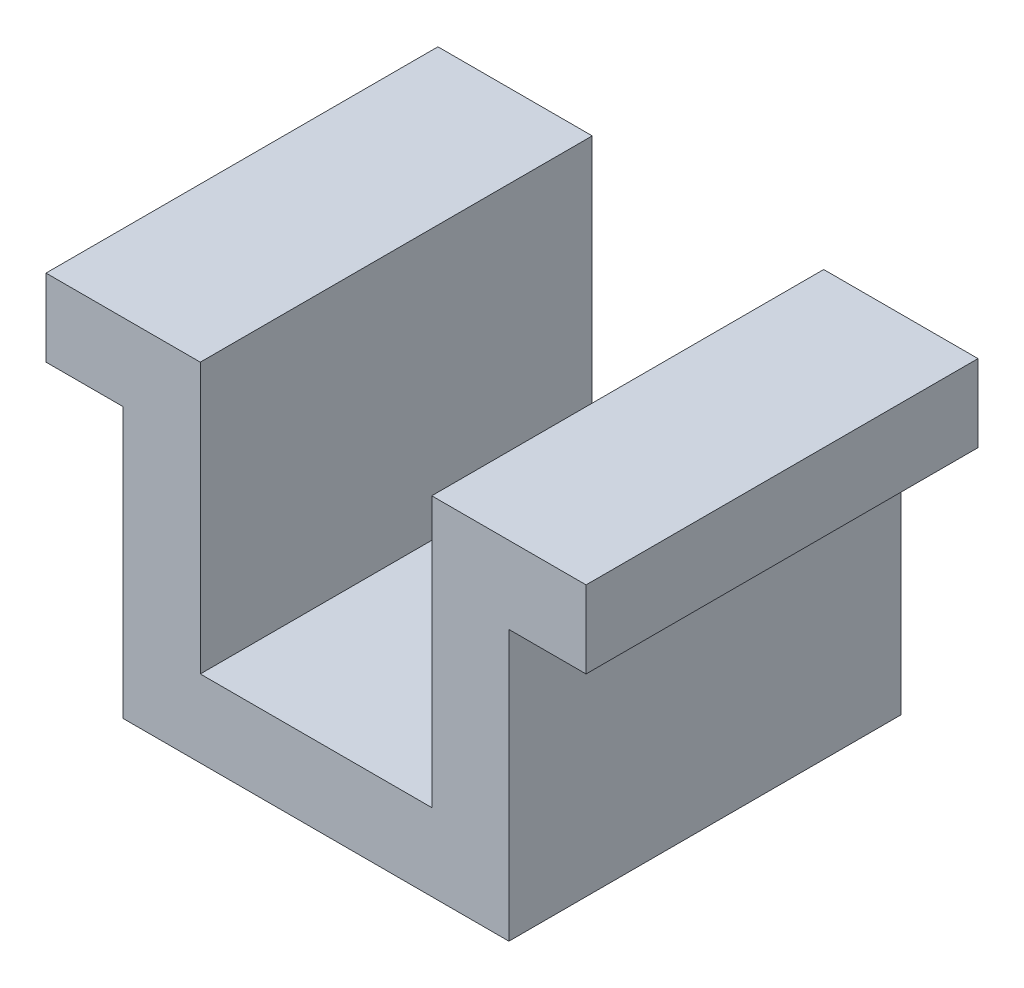
ISO-10303-21;
HEADER;
FILE_DESCRIPTION(('STEP AP214'),'2;1');
FILE_NAME('part.step','',(''),(''),'','','');
FILE_SCHEMA(('AUTOMOTIVE_DESIGN { 1 0 10303 214 1 1 1 1 }'));
ENDSEC;
DATA;
#1=APPLICATION_CONTEXT('core data for automotive mechanical design processes');
#2=APPLICATION_PROTOCOL_DEFINITION('international standard','automotive_design',2000,#1);
#3=PRODUCT_CONTEXT('',#1,'mechanical');
#4=PRODUCT('Part','Part','',(#3));
#5=PRODUCT_RELATED_PRODUCT_CATEGORY('part','',(#4));
#6=PRODUCT_DEFINITION_FORMATION('','',#4);
#7=PRODUCT_DEFINITION_CONTEXT('part definition',#1,'design');
#8=PRODUCT_DEFINITION('design','',#6,#7);
#9=PRODUCT_DEFINITION_SHAPE('','',#8);
#10=(LENGTH_UNIT() NAMED_UNIT(*) SI_UNIT(.MILLI.,.METRE.));
#11=(NAMED_UNIT(*) PLANE_ANGLE_UNIT() SI_UNIT($,.RADIAN.));
#12=(NAMED_UNIT(*) SI_UNIT($,.STERADIAN.) SOLID_ANGLE_UNIT());
#13=UNCERTAINTY_MEASURE_WITH_UNIT(LENGTH_MEASURE(1.E-05),#10,'distance_accuracy_value','');
#14=(GEOMETRIC_REPRESENTATION_CONTEXT(3) GLOBAL_UNCERTAINTY_ASSIGNED_CONTEXT((#13)) GLOBAL_UNIT_ASSIGNED_CONTEXT((#10,
#11,#12)) REPRESENTATION_CONTEXT('',''));
#15=CARTESIAN_POINT('',(0.,0.,0.));
#16=DIRECTION('',(0.,0.,1.));
#17=DIRECTION('',(1.,0.,0.));
#18=AXIS2_PLACEMENT_3D('',#15,#16,#17);
#19=CARTESIAN_POINT('',(50.,35.,25.4));
#20=DIRECTION('',(0.,1.,0.));
#21=DIRECTION('',(0.,0.,1.));
#22=AXIS2_PLACEMENT_3D('',#19,#20,#21);
#23=PLANE('',#22);
#24=DIRECTION('',(1.,0.,0.));
#25=VECTOR('',#24,1.);
#26=CARTESIAN_POINT('',(50.,35.,-25.4));
#27=LINE('',#26,#25);
#28=CARTESIAN_POINT('',(50.,35.,-25.4));
#29=VERTEX_POINT('',#28);
#30=CARTESIAN_POINT('',(60.,35.,-25.4));
#31=VERTEX_POINT('',#30);
#32=EDGE_CURVE('E154',#29,#31,#27,.T.);
#33=ORIENTED_EDGE('',*,*,#32,.T.);
#34=DIRECTION('',(0.,0.,-1.));
#35=VECTOR('',#34,1.);
#36=CARTESIAN_POINT('',(60.,35.,25.4));
#37=LINE('',#36,#35);
#38=CARTESIAN_POINT('',(60.,35.,25.4));
#39=VERTEX_POINT('',#38);
#40=EDGE_CURVE('E11',#39,#31,#37,.T.);
#41=ORIENTED_EDGE('',*,*,#40,.F.);
#42=DIRECTION('',(1.,0.,0.));
#43=VECTOR('',#42,1.);
#44=CARTESIAN_POINT('',(50.,35.,25.4));
#45=LINE('',#44,#43);
#46=CARTESIAN_POINT('',(50.,35.,25.4));
#47=VERTEX_POINT('',#46);
#48=EDGE_CURVE('E102',#47,#39,#45,.T.);
#49=ORIENTED_EDGE('',*,*,#48,.F.);
#50=DIRECTION('',(0.,0.,-1.));
#51=VECTOR('',#50,1.);
#52=CARTESIAN_POINT('',(50.,35.,25.4));
#53=LINE('',#52,#51);
#54=EDGE_CURVE('E150',#47,#29,#53,.T.);
#55=ORIENTED_EDGE('',*,*,#54,.T.);
#56=EDGE_LOOP('',(#33,#41,#49,#55));
#57=FACE_BOUND('',#56,.T.);
#58=ADVANCED_FACE('F34',(#57),#23,.F.);
#59=CARTESIAN_POINT('',(60.,45.,25.4));
#60=DIRECTION('',(1.,0.,0.));
#61=DIRECTION('',(0.,0.,-1.));
#62=AXIS2_PLACEMENT_3D('',#59,#60,#61);
#63=PLANE('',#62);
#64=DIRECTION('',(0.,-1.,0.));
#65=VECTOR('',#64,1.);
#66=CARTESIAN_POINT('',(60.,45.,-25.4));
#67=LINE('',#66,#65);
#68=CARTESIAN_POINT('',(60.,45.,-25.4));
#69=VERTEX_POINT('',#68);
#70=EDGE_CURVE('E157',#69,#31,#67,.T.);
#71=ORIENTED_EDGE('',*,*,#70,.F.);
#72=DIRECTION('',(0.,0.,-1.));
#73=VECTOR('',#72,1.);
#74=CARTESIAN_POINT('',(60.,45.,25.4));
#75=LINE('',#74,#73);
#76=CARTESIAN_POINT('',(60.,45.,25.4));
#77=VERTEX_POINT('',#76);
#78=EDGE_CURVE('E42',#77,#69,#75,.T.);
#79=ORIENTED_EDGE('',*,*,#78,.F.);
#80=DIRECTION('',(0.,-1.,0.));
#81=VECTOR('',#80,1.);
#82=CARTESIAN_POINT('',(60.,45.,25.4));
#83=LINE('',#82,#81);
#84=EDGE_CURVE('E220',#77,#39,#83,.T.);
#85=ORIENTED_EDGE('',*,*,#84,.T.);
#86=ORIENTED_EDGE('',*,*,#40,.T.);
#87=EDGE_LOOP('',(#71,#79,#85,#86));
#88=FACE_BOUND('',#87,.T.);
#89=ADVANCED_FACE('F207',(#88),#63,.T.);
#90=CARTESIAN_POINT('',(50.,45.,25.4));
#91=DIRECTION('',(0.,1.,0.));
#92=DIRECTION('',(0.,0.,1.));
#93=AXIS2_PLACEMENT_3D('',#90,#91,#92);
#94=PLANE('',#93);
#95=DIRECTION('',(1.,0.,0.));
#96=VECTOR('',#95,1.);
#97=CARTESIAN_POINT('',(50.,45.,-25.4));
#98=LINE('',#97,#96);
#99=CARTESIAN_POINT('',(40.,45.,-25.4));
#100=VERTEX_POINT('',#99);
#101=EDGE_CURVE('E161',#100,#69,#98,.T.);
#102=ORIENTED_EDGE('',*,*,#101,.F.);
#103=DIRECTION('',(0.,0.,-1.));
#104=VECTOR('',#103,1.);
#105=CARTESIAN_POINT('',(40.,45.,25.4));
#106=LINE('',#105,#104);
#107=CARTESIAN_POINT('',(40.,45.,25.4));
#108=VERTEX_POINT('',#107);
#109=EDGE_CURVE('E197',#108,#100,#106,.T.);
#110=ORIENTED_EDGE('',*,*,#109,.F.);
#111=DIRECTION('',(1.,0.,0.));
#112=VECTOR('',#111,1.);
#113=CARTESIAN_POINT('',(50.,45.,25.4));
#114=LINE('',#113,#112);
#115=EDGE_CURVE('E204',#108,#77,#114,.T.);
#116=ORIENTED_EDGE('',*,*,#115,.T.);
#117=ORIENTED_EDGE('',*,*,#78,.T.);
#118=EDGE_LOOP('',(#102,#110,#116,#117));
#119=FACE_BOUND('',#118,.T.);
#120=ADVANCED_FACE('F202',(#119),#94,.T.);
#121=CARTESIAN_POINT('',(40.,0.,25.4));
#122=DIRECTION('',(-1.,0.,0.));
#123=DIRECTION('',(0.,0.,1.));
#124=AXIS2_PLACEMENT_3D('',#121,#122,#123);
#125=PLANE('',#124);
#126=DIRECTION('',(0.,1.,0.));
#127=VECTOR('',#126,1.);
#128=CARTESIAN_POINT('',(40.,0.,-25.4));
#129=LINE('',#128,#127);
#130=CARTESIAN_POINT('',(40.,10.,-25.4));
#131=VERTEX_POINT('',#130);
#132=EDGE_CURVE('E164',#131,#100,#129,.T.);
#133=ORIENTED_EDGE('',*,*,#132,.F.);
#134=DIRECTION('',(0.,0.,-1.));
#135=VECTOR('',#134,1.);
#136=CARTESIAN_POINT('',(40.,10.,25.4));
#137=LINE('',#136,#135);
#138=CARTESIAN_POINT('',(40.,10.,25.4));
#139=VERTEX_POINT('',#138);
#140=EDGE_CURVE('E195',#139,#131,#137,.T.);
#141=ORIENTED_EDGE('',*,*,#140,.F.);
#142=DIRECTION('',(0.,1.,0.));
#143=VECTOR('',#142,1.);
#144=CARTESIAN_POINT('',(40.,0.,25.4));
#145=LINE('',#144,#143);
#146=EDGE_CURVE('E217',#139,#108,#145,.T.);
#147=ORIENTED_EDGE('',*,*,#146,.T.);
#148=ORIENTED_EDGE('',*,*,#109,.T.);
#149=EDGE_LOOP('',(#133,#141,#147,#148));
#150=FACE_BOUND('',#149,.T.);
#151=ADVANCED_FACE('F214',(#150),#125,.T.);
#152=CARTESIAN_POINT('',(0.,10.,25.4));
#153=DIRECTION('',(0.,1.,0.));
#154=DIRECTION('',(0.,0.,1.));
#155=AXIS2_PLACEMENT_3D('',#152,#153,#154);
#156=PLANE('',#155);
#157=CARTESIAN_POINT('',(25.,10.,0.));
#158=DIRECTION('',(0.,1.,0.));
#159=DIRECTION('',(0.,0.,1.));
#160=AXIS2_PLACEMENT_3D('',#157,#158,#159);
#161=CIRCLE('',#160,4.7625);
#162=CARTESIAN_POINT('',(25.,10.,4.7625));
#163=VERTEX_POINT('',#162);
#164=EDGE_CURVE('E284',#163,#163,#161,.T.);
#165=ORIENTED_EDGE('',*,*,#164,.F.);
#166=EDGE_LOOP('',(#165));
#167=FACE_BOUND('',#166,.T.);
#168=DIRECTION('',(1.,0.,0.));
#169=VECTOR('',#168,1.);
#170=CARTESIAN_POINT('',(0.,10.,-25.4));
#171=LINE('',#170,#169);
#172=CARTESIAN_POINT('',(10.,10.,-25.4));
#173=VERTEX_POINT('',#172);
#174=EDGE_CURVE('E167',#173,#131,#171,.T.);
#175=ORIENTED_EDGE('',*,*,#174,.F.);
#176=DIRECTION('',(0.,0.,-1.));
#177=VECTOR('',#176,1.);
#178=CARTESIAN_POINT('',(10.,10.,25.4));
#179=LINE('',#178,#177);
#180=CARTESIAN_POINT('',(10.,10.,25.4));
#181=VERTEX_POINT('',#180);
#182=EDGE_CURVE('E193',#181,#173,#179,.T.);
#183=ORIENTED_EDGE('',*,*,#182,.F.);
#184=DIRECTION('',(1.,0.,0.));
#185=VECTOR('',#184,1.);
#186=CARTESIAN_POINT('',(0.,10.,25.4));
#187=LINE('',#186,#185);
#188=EDGE_CURVE('E222',#181,#139,#187,.T.);
#189=ORIENTED_EDGE('',*,*,#188,.T.);
#190=ORIENTED_EDGE('',*,*,#140,.T.);
#191=EDGE_LOOP('',(#175,#183,#189,#190));
#192=FACE_BOUND('',#191,.T.);
#193=ADVANCED_FACE('F288',(#167,#192),#156,.T.);
#194=CARTESIAN_POINT('',(10.,0.,25.4));
#195=DIRECTION('',(1.,0.,0.));
#196=DIRECTION('',(0.,0.,-1.));
#197=AXIS2_PLACEMENT_3D('',#194,#195,#196);
#198=PLANE('',#197);
#199=DIRECTION('',(0.,1.,0.));
#200=VECTOR('',#199,1.);
#201=CARTESIAN_POINT('',(10.,0.,-25.4));
#202=LINE('',#201,#200);
#203=CARTESIAN_POINT('',(10.,45.,-25.4));
#204=VERTEX_POINT('',#203);
#205=EDGE_CURVE('E170',#204,#173,#202,.F.);
#206=ORIENTED_EDGE('',*,*,#205,.F.);
#207=DIRECTION('',(0.,0.,-1.));
#208=VECTOR('',#207,1.);
#209=CARTESIAN_POINT('',(10.,45.,25.4));
#210=LINE('',#209,#208);
#211=CARTESIAN_POINT('',(10.,45.,25.4));
#212=VERTEX_POINT('',#211);
#213=EDGE_CURVE('E191',#212,#204,#210,.T.);
#214=ORIENTED_EDGE('',*,*,#213,.F.);
#215=DIRECTION('',(0.,1.,0.));
#216=VECTOR('',#215,1.);
#217=CARTESIAN_POINT('',(10.,0.,25.4));
#218=LINE('',#217,#216);
#219=EDGE_CURVE('E228',#212,#181,#218,.F.);
#220=ORIENTED_EDGE('',*,*,#219,.T.);
#221=ORIENTED_EDGE('',*,*,#182,.T.);
#222=EDGE_LOOP('',(#206,#214,#220,#221));
#223=FACE_BOUND('',#222,.T.);
#224=ADVANCED_FACE('F291',(#223),#198,.T.);
#225=CARTESIAN_POINT('',(0.,45.,25.4));
#226=DIRECTION('',(0.,1.,0.));
#227=DIRECTION('',(0.,0.,1.));
#228=AXIS2_PLACEMENT_3D('',#225,#226,#227);
#229=PLANE('',#228);
#230=DIRECTION('',(1.,0.,0.));
#231=VECTOR('',#230,1.);
#232=CARTESIAN_POINT('',(0.,45.,-25.4));
#233=LINE('',#232,#231);
#234=CARTESIAN_POINT('',(-10.,45.,-25.4));
#235=VERTEX_POINT('',#234);
#236=EDGE_CURVE('E173',#235,#204,#233,.T.);
#237=ORIENTED_EDGE('',*,*,#236,.F.);
#238=DIRECTION('',(0.,0.,-1.));
#239=VECTOR('',#238,1.);
#240=CARTESIAN_POINT('',(-10.,45.,25.4));
#241=LINE('',#240,#239);
#242=CARTESIAN_POINT('',(-10.,45.,25.4));
#243=VERTEX_POINT('',#242);
#244=EDGE_CURVE('E189',#243,#235,#241,.T.);
#245=ORIENTED_EDGE('',*,*,#244,.F.);
#246=DIRECTION('',(1.,0.,0.));
#247=VECTOR('',#246,1.);
#248=CARTESIAN_POINT('',(0.,45.,25.4));
#249=LINE('',#248,#247);
#250=EDGE_CURVE('E231',#243,#212,#249,.T.);
#251=ORIENTED_EDGE('',*,*,#250,.T.);
#252=ORIENTED_EDGE('',*,*,#213,.T.);
#253=EDGE_LOOP('',(#237,#245,#251,#252));
#254=FACE_BOUND('',#253,.T.);
#255=ADVANCED_FACE('F243',(#254),#229,.T.);
#256=CARTESIAN_POINT('',(-10.,35.,25.4));
#257=DIRECTION('',(-1.,0.,0.));
#258=DIRECTION('',(0.,0.,1.));
#259=AXIS2_PLACEMENT_3D('',#256,#257,#258);
#260=PLANE('',#259);
#261=DIRECTION('',(0.,1.,0.));
#262=VECTOR('',#261,1.);
#263=CARTESIAN_POINT('',(-10.,35.,-25.4));
#264=LINE('',#263,#262);
#265=CARTESIAN_POINT('',(-10.,35.,-25.4));
#266=VERTEX_POINT('',#265);
#267=EDGE_CURVE('E176',#266,#235,#264,.T.);
#268=ORIENTED_EDGE('',*,*,#267,.F.);
#269=DIRECTION('',(0.,0.,-1.));
#270=VECTOR('',#269,1.);
#271=CARTESIAN_POINT('',(-10.,35.,25.4));
#272=LINE('',#271,#270);
#273=CARTESIAN_POINT('',(-10.,35.,25.4));
#274=VERTEX_POINT('',#273);
#275=EDGE_CURVE('E187',#274,#266,#272,.T.);
#276=ORIENTED_EDGE('',*,*,#275,.F.);
#277=DIRECTION('',(0.,1.,0.));
#278=VECTOR('',#277,1.);
#279=CARTESIAN_POINT('',(-10.,35.,25.4));
#280=LINE('',#279,#278);
#281=EDGE_CURVE('E234',#274,#243,#280,.T.);
#282=ORIENTED_EDGE('',*,*,#281,.T.);
#283=ORIENTED_EDGE('',*,*,#244,.T.);
#284=EDGE_LOOP('',(#268,#276,#282,#283));
#285=FACE_BOUND('',#284,.T.);
#286=ADVANCED_FACE('F238',(#285),#260,.T.);
#287=CARTESIAN_POINT('',(0.,35.,25.4));
#288=DIRECTION('',(0.,1.,0.));
#289=DIRECTION('',(0.,0.,1.));
#290=AXIS2_PLACEMENT_3D('',#287,#288,#289);
#291=PLANE('',#290);
#292=DIRECTION('',(1.,0.,0.));
#293=VECTOR('',#292,1.);
#294=CARTESIAN_POINT('',(0.,35.,-25.4));
#295=LINE('',#294,#293);
#296=CARTESIAN_POINT('',(0.,35.,-25.4));
#297=VERTEX_POINT('',#296);
#298=EDGE_CURVE('E179',#266,#297,#295,.T.);
#299=ORIENTED_EDGE('',*,*,#298,.T.);
#300=DIRECTION('',(0.,0.,-1.));
#301=VECTOR('',#300,1.);
#302=CARTESIAN_POINT('',(0.,35.,25.4));
#303=LINE('',#302,#301);
#304=CARTESIAN_POINT('',(0.,35.,25.4));
#305=VERTEX_POINT('',#304);
#306=EDGE_CURVE('E145',#305,#297,#303,.T.);
#307=ORIENTED_EDGE('',*,*,#306,.F.);
#308=DIRECTION('',(1.,0.,0.));
#309=VECTOR('',#308,1.);
#310=CARTESIAN_POINT('',(0.,35.,25.4));
#311=LINE('',#310,#309);
#312=EDGE_CURVE('E136',#274,#305,#311,.T.);
#313=ORIENTED_EDGE('',*,*,#312,.F.);
#314=ORIENTED_EDGE('',*,*,#275,.T.);
#315=EDGE_LOOP('',(#299,#307,#313,#314));
#316=FACE_BOUND('',#315,.T.);
#317=ADVANCED_FACE('F247',(#316),#291,.F.);
#318=CARTESIAN_POINT('',(0.,0.,25.4));
#319=DIRECTION('',(1.,0.,0.));
#320=DIRECTION('',(0.,0.,-1.));
#321=AXIS2_PLACEMENT_3D('',#318,#319,#320);
#322=PLANE('',#321);
#323=DIRECTION('',(0.,-1.,0.));
#324=VECTOR('',#323,1.);
#325=CARTESIAN_POINT('',(0.,0.,-25.4));
#326=LINE('',#325,#324);
#327=CARTESIAN_POINT('',(0.,0.,-25.4));
#328=VERTEX_POINT('',#327);
#329=EDGE_CURVE('E144',#297,#328,#326,.T.);
#330=ORIENTED_EDGE('',*,*,#329,.T.);
#331=DIRECTION('',(0.,0.,-1.));
#332=VECTOR('',#331,1.);
#333=CARTESIAN_POINT('',(0.,0.,25.4));
#334=LINE('',#333,#332);
#335=CARTESIAN_POINT('',(0.,0.,25.4));
#336=VERTEX_POINT('',#335);
#337=EDGE_CURVE('E141',#336,#328,#334,.T.);
#338=ORIENTED_EDGE('',*,*,#337,.F.);
#339=DIRECTION('',(0.,-1.,0.));
#340=VECTOR('',#339,1.);
#341=CARTESIAN_POINT('',(0.,0.,25.4));
#342=LINE('',#341,#340);
#343=EDGE_CURVE('E129',#305,#336,#342,.T.);
#344=ORIENTED_EDGE('',*,*,#343,.F.);
#345=ORIENTED_EDGE('',*,*,#306,.T.);
#346=EDGE_LOOP('',(#330,#338,#344,#345));
#347=FACE_BOUND('',#346,.T.);
#348=ADVANCED_FACE('F142',(#347),#322,.F.);
#349=CARTESIAN_POINT('',(0.,0.,25.4));
#350=DIRECTION('',(0.,1.,0.));
#351=DIRECTION('',(0.,0.,1.));
#352=AXIS2_PLACEMENT_3D('',#349,#350,#351);
#353=PLANE('',#352);
#354=CARTESIAN_POINT('',(25.,0.,0.));
#355=DIRECTION('',(0.,1.,0.));
#356=DIRECTION('',(0.,0.,1.));
#357=AXIS2_PLACEMENT_3D('',#354,#355,#356);
#358=CIRCLE('',#357,4.7625);
#359=CARTESIAN_POINT('',(25.,0.,4.7625));
#360=VERTEX_POINT('',#359);
#361=EDGE_CURVE('E158',#360,#360,#358,.T.);
#362=ORIENTED_EDGE('',*,*,#361,.T.);
#363=EDGE_LOOP('',(#362));
#364=FACE_BOUND('',#363,.T.);
#365=DIRECTION('',(1.,0.,0.));
#366=VECTOR('',#365,1.);
#367=CARTESIAN_POINT('',(0.,0.,-25.4));
#368=LINE('',#367,#366);
#369=CARTESIAN_POINT('',(50.,0.,-25.4));
#370=VERTEX_POINT('',#369);
#371=EDGE_CURVE('E90',#328,#370,#368,.T.);
#372=ORIENTED_EDGE('',*,*,#371,.T.);
#373=DIRECTION('',(0.,0.,-1.));
#374=VECTOR('',#373,1.);
#375=CARTESIAN_POINT('',(50.,0.,25.4));
#376=LINE('',#375,#374);
#377=CARTESIAN_POINT('',(50.,0.,25.4));
#378=VERTEX_POINT('',#377);
#379=EDGE_CURVE('E146',#378,#370,#376,.T.);
#380=ORIENTED_EDGE('',*,*,#379,.F.);
#381=DIRECTION('',(1.,0.,0.));
#382=VECTOR('',#381,1.);
#383=CARTESIAN_POINT('',(0.,0.,25.4));
#384=LINE('',#383,#382);
#385=EDGE_CURVE('E133',#336,#378,#384,.T.);
#386=ORIENTED_EDGE('',*,*,#385,.F.);
#387=ORIENTED_EDGE('',*,*,#337,.T.);
#388=EDGE_LOOP('',(#372,#380,#386,#387));
#389=FACE_BOUND('',#388,.T.);
#390=ADVANCED_FACE('F148',(#364,#389),#353,.F.);
#391=CARTESIAN_POINT('',(50.,0.,25.4));
#392=DIRECTION('',(-1.,0.,0.));
#393=DIRECTION('',(0.,0.,1.));
#394=AXIS2_PLACEMENT_3D('',#391,#392,#393);
#395=PLANE('',#394);
#396=DIRECTION('',(0.,1.,0.));
#397=VECTOR('',#396,1.);
#398=CARTESIAN_POINT('',(50.,0.,-25.4));
#399=LINE('',#398,#397);
#400=EDGE_CURVE('E96',#370,#29,#399,.T.);
#401=ORIENTED_EDGE('',*,*,#400,.T.);
#402=ORIENTED_EDGE('',*,*,#54,.F.);
#403=DIRECTION('',(0.,1.,0.));
#404=VECTOR('',#403,1.);
#405=CARTESIAN_POINT('',(50.,0.,25.4));
#406=LINE('',#405,#404);
#407=EDGE_CURVE('E50',#378,#47,#406,.T.);
#408=ORIENTED_EDGE('',*,*,#407,.F.);
#409=ORIENTED_EDGE('',*,*,#379,.T.);
#410=EDGE_LOOP('',(#401,#402,#408,#409));
#411=FACE_BOUND('',#410,.T.);
#412=ADVANCED_FACE('F261',(#411),#395,.F.);
#413=CARTESIAN_POINT('',(0.,0.,25.4));
#414=DIRECTION('',(0.,0.,-1.));
#415=DIRECTION('',(-1.,0.,0.));
#416=AXIS2_PLACEMENT_3D('',#413,#414,#415);
#417=PLANE('',#416);
#418=ORIENTED_EDGE('',*,*,#48,.T.);
#419=ORIENTED_EDGE('',*,*,#84,.F.);
#420=ORIENTED_EDGE('',*,*,#115,.F.);
#421=ORIENTED_EDGE('',*,*,#146,.F.);
#422=ORIENTED_EDGE('',*,*,#188,.F.);
#423=ORIENTED_EDGE('',*,*,#219,.F.);
#424=ORIENTED_EDGE('',*,*,#250,.F.);
#425=ORIENTED_EDGE('',*,*,#281,.F.);
#426=ORIENTED_EDGE('',*,*,#312,.T.);
#427=ORIENTED_EDGE('',*,*,#343,.T.);
#428=ORIENTED_EDGE('',*,*,#385,.T.);
#429=ORIENTED_EDGE('',*,*,#407,.T.);
#430=EDGE_LOOP('',(#418,#419,#420,#421,#422,#423,#424,#425,#426,#427,#428,#429));
#431=FACE_BOUND('',#430,.T.);
#432=ADVANCED_FACE('F131',(#431),#417,.F.);
#433=CARTESIAN_POINT('',(0.,0.,-25.4));
#434=DIRECTION('',(0.,0.,-1.));
#435=DIRECTION('',(-1.,0.,0.));
#436=AXIS2_PLACEMENT_3D('',#433,#434,#435);
#437=PLANE('',#436);
#438=ORIENTED_EDGE('',*,*,#32,.F.);
#439=ORIENTED_EDGE('',*,*,#400,.F.);
#440=ORIENTED_EDGE('',*,*,#371,.F.);
#441=ORIENTED_EDGE('',*,*,#329,.F.);
#442=ORIENTED_EDGE('',*,*,#298,.F.);
#443=ORIENTED_EDGE('',*,*,#267,.T.);
#444=ORIENTED_EDGE('',*,*,#236,.T.);
#445=ORIENTED_EDGE('',*,*,#205,.T.);
#446=ORIENTED_EDGE('',*,*,#174,.T.);
#447=ORIENTED_EDGE('',*,*,#132,.T.);
#448=ORIENTED_EDGE('',*,*,#101,.T.);
#449=ORIENTED_EDGE('',*,*,#70,.T.);
#450=EDGE_LOOP('',(#438,#439,#440,#441,#442,#443,#444,#445,#446,#447,#448,#449));
#451=FACE_BOUND('',#450,.T.);
#452=ADVANCED_FACE('F210',(#451),#437,.T.);
#453=CARTESIAN_POINT('',(25.,0.,0.));
#454=DIRECTION('',(0.,1.,0.));
#455=DIRECTION('',(0.,0.,1.));
#456=AXIS2_PLACEMENT_3D('',#453,#454,#455);
#457=CYLINDRICAL_SURFACE('',#456,4.7625);
#458=ORIENTED_EDGE('',*,*,#361,.F.);
#459=EDGE_LOOP('',(#458));
#460=FACE_BOUND('',#459,.T.);
#461=ORIENTED_EDGE('',*,*,#164,.T.);
#462=EDGE_LOOP('',(#461));
#463=FACE_BOUND('',#462,.T.);
#464=ADVANCED_FACE('F273',(#460,#463),#457,.F.);
#465=CLOSED_SHELL('',(#58,#89,#120,#151,#193,#224,#255,#286,#317,#348,#390,#412,#432,#452,#464));
#466=MANIFOLD_SOLID_BREP('B2',#465);
#467=ADVANCED_BREP_SHAPE_REPRESENTATION('',(#18,#466),#14);
#468=SHAPE_DEFINITION_REPRESENTATION(#9,#467);
ENDSEC;
END-ISO-10303-21;
